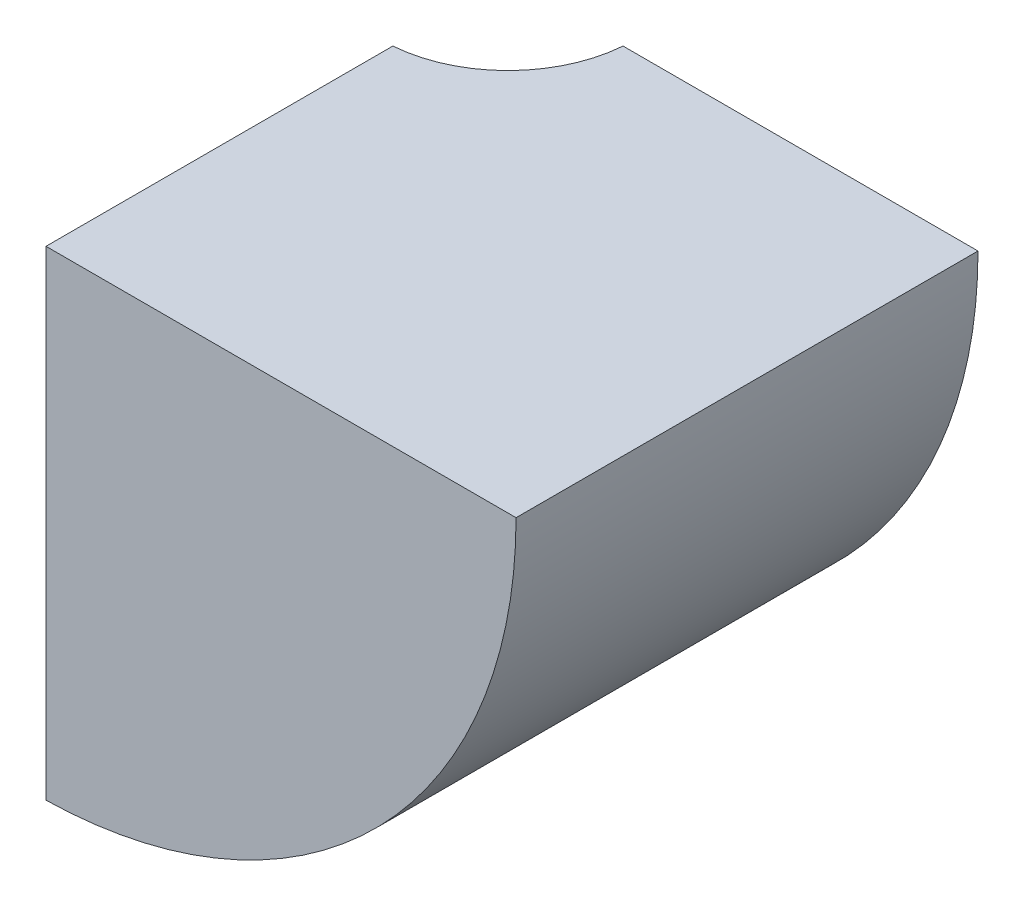
ISO-10303-21;
HEADER;
FILE_DESCRIPTION(('STEP AP214'),'2;1');
FILE_NAME('part.step','',(''),(''),'','','');
FILE_SCHEMA(('AUTOMOTIVE_DESIGN { 1 0 10303 214 1 1 1 1 }'));
ENDSEC;
DATA;
#1=APPLICATION_CONTEXT('core data for automotive mechanical design processes');
#2=APPLICATION_PROTOCOL_DEFINITION('international standard','automotive_design',2000,#1);
#3=PRODUCT_CONTEXT('',#1,'mechanical');
#4=PRODUCT('Part','Part','',(#3));
#5=PRODUCT_RELATED_PRODUCT_CATEGORY('part','',(#4));
#6=PRODUCT_DEFINITION_FORMATION('','',#4);
#7=PRODUCT_DEFINITION_CONTEXT('part definition',#1,'design');
#8=PRODUCT_DEFINITION('design','',#6,#7);
#9=PRODUCT_DEFINITION_SHAPE('','',#8);
#10=(LENGTH_UNIT() NAMED_UNIT(*) SI_UNIT(.MILLI.,.METRE.));
#11=(NAMED_UNIT(*) PLANE_ANGLE_UNIT() SI_UNIT($,.RADIAN.));
#12=(NAMED_UNIT(*) SI_UNIT($,.STERADIAN.) SOLID_ANGLE_UNIT());
#13=UNCERTAINTY_MEASURE_WITH_UNIT(LENGTH_MEASURE(1.E-05),#10,'distance_accuracy_value','');
#14=(GEOMETRIC_REPRESENTATION_CONTEXT(3) GLOBAL_UNCERTAINTY_ASSIGNED_CONTEXT((#13)) GLOBAL_UNIT_ASSIGNED_CONTEXT((#10,
#11,#12)) REPRESENTATION_CONTEXT('',''));
#15=CARTESIAN_POINT('',(0.,0.,0.));
#16=DIRECTION('',(0.,0.,1.));
#17=DIRECTION('',(1.,0.,0.));
#18=AXIS2_PLACEMENT_3D('',#15,#16,#17);
#19=CARTESIAN_POINT('',(0.,0.,29.));
#20=DIRECTION('',(0.,0.,-1.));
#21=DIRECTION('',(-1.,0.,0.));
#22=AXIS2_PLACEMENT_3D('',#19,#20,#21);
#23=CYLINDRICAL_SURFACE('',#22,29.5);
#24=CARTESIAN_POINT('',(0.,0.,29.));
#25=DIRECTION('',(0.,0.,1.));
#26=DIRECTION('',(1.,0.,0.));
#27=AXIS2_PLACEMENT_3D('',#24,#25,#26);
#28=CIRCLE('',#27,29.5);
#29=CARTESIAN_POINT('',(0.6,-29.4938976739257,29.));
#30=VERTEX_POINT('',#29);
#31=CARTESIAN_POINT('',(29.5,0.,29.));
#32=VERTEX_POINT('',#31);
#33=EDGE_CURVE('E100',#30,#32,#28,.T.);
#34=ORIENTED_EDGE('',*,*,#33,.F.);
#35=DIRECTION('',(0.,0.,-1.));
#36=VECTOR('',#35,1.);
#37=CARTESIAN_POINT('',(0.6,-29.4938976739257,29.));
#38=LINE('',#37,#36);
#39=CARTESIAN_POINT('',(0.6,-29.4938976739257,7.6765877836445));
#40=VERTEX_POINT('',#39);
#41=EDGE_CURVE('E81',#30,#40,#38,.T.);
#42=ORIENTED_EDGE('',*,*,#41,.T.);
#43=CARTESIAN_POINT('',(0.,-29.5,7.69999999999999));
#44=CARTESIAN_POINT('',(0.212742343388148,-29.500022647287,7.70002706474274));
#45=CARTESIAN_POINT('',(0.425476347259747,-29.4976994819734,7.69118445742644));
#46=CARTESIAN_POINT('',(0.849354949937432,-29.4885260735209,7.65595876865986));
#47=CARTESIAN_POINT('',(1.06049980460666,-29.4816765756339,7.62957857473477));
#48=CARTESIAN_POINT('',(1.47926599440452,-29.4636335809967,7.55954877837209));
#49=CARTESIAN_POINT('',(1.68689370037372,-29.4524490758022,7.51593491791784));
#50=CARTESIAN_POINT('',(2.09760532203794,-29.4260492673962,7.41180996030293));
#51=CARTESIAN_POINT('',(2.30068918116078,-29.4108339140298,7.35129865289055));
#52=CARTESIAN_POINT('',(2.70085358483705,-29.376788677435,7.21388483244407));
#53=CARTESIAN_POINT('',(2.89793579252656,-29.3579598063173,7.13698690847597));
#54=CARTESIAN_POINT('',(3.28491062238014,-29.3171832290267,6.96735321137268));
#55=CARTESIAN_POINT('',(3.47480055612946,-29.2952343709174,6.87461158599068));
#56=CARTESIAN_POINT('',(3.84609330616336,-29.2488047198207,6.67398660929673));
#57=CARTESIAN_POINT('',(4.02749559169331,-29.2243237688015,6.56610231275713));
#58=CARTESIAN_POINT('',(4.38066050734384,-29.17347508541,6.33594833876668));
#59=CARTESIAN_POINT('',(4.55242269336397,-29.1471072662405,6.21367799938121));
#60=CARTESIAN_POINT('',(4.88853747602184,-29.092641036983,5.95300965640012));
#61=CARTESIAN_POINT('',(5.05267535307612,-29.0645186660506,5.81433972678294));
#62=CARTESIAN_POINT('',(5.36875163654413,-29.0077971092044,5.52381971379875));
#63=CARTESIAN_POINT('',(5.52068990096989,-28.9791979177457,5.3719694770725));
#64=CARTESIAN_POINT('',(5.81141532781892,-28.9222993952559,5.05604045223973));
#65=CARTESIAN_POINT('',(5.95019933986526,-28.8940001374915,4.89195875148427));
#66=CARTESIAN_POINT('',(6.21364797125605,-28.8384934739615,4.55265974751919));
#67=CARTESIAN_POINT('',(6.33831294509316,-28.8112860407941,4.37744272406132));
#68=CARTESIAN_POINT('',(6.57464962851288,-28.7582840629336,4.01394635278045));
#69=CARTESIAN_POINT('',(6.6860660779084,-28.7325211760508,3.82549626700681));
#70=CARTESIAN_POINT('',(6.89253711732572,-28.6836919981863,3.43959390929711));
#71=CARTESIAN_POINT('',(6.98759781944607,-28.6606247009084,3.242145035227));
#72=CARTESIAN_POINT('',(7.16061533796719,-28.617888412141,2.8396363223017));
#73=CARTESIAN_POINT('',(7.2385805564665,-28.598217752285,2.63458028042393));
#74=CARTESIAN_POINT('',(7.37679403484349,-28.5628776323333,2.21833899961841));
#75=CARTESIAN_POINT('',(7.43704671442757,-28.5472071742194,2.00715530416308));
#76=CARTESIAN_POINT('',(7.55839066054057,-28.5153665186318,1.50047453454248));
#77=CARTESIAN_POINT('',(7.61144264862481,-28.501182313947,1.20285922851761));
#78=CARTESIAN_POINT('',(7.66454271555895,-28.4869279904295,0.753392453441745));
#79=CARTESIAN_POINT('',(7.67782974569565,-28.4833468881888,0.603080557191606));
#80=CARTESIAN_POINT('',(7.69555897327461,-28.4785607280752,0.301861036041828));
#81=CARTESIAN_POINT('',(7.69999897846711,-28.4773562591213,0.150953272769096));
#82=CARTESIAN_POINT('',(7.7,-28.4773594281492,0.));
#83=B_SPLINE_CURVE_WITH_KNOTS('',3,(#43,#44,#45,#46,#47,#48,#49,#50,#51,#52,#53,#54,#55,#56,#57,
#58,#59,#60,#61,#62,#63,#64,#65,#66,#67,#68,#69,#70,#71,#72,#73,#74,#75,#76,#77,#78,#79,#80,#81,
#82),.UNSPECIFIED.,.F.,.F.,(4,2,2,2,2,2,2,2,2,2,2,2,2,2,2,2,2,2,2,4),(0.,0.638017965139099,
1.27593090802698,1.91252772931685,2.54913247201258,3.18555916752925,3.82222145263155,
4.45892349681235,5.09565484857049,5.74502357539887,6.39439985895824,7.04393127394829,
7.69344637726192,8.35394086985032,9.01418799879507,9.67410989810249,10.3338669909095,
11.2392520050083,11.6918392132163,12.1445385563943),.UNSPECIFIED.);
#84=CARTESIAN_POINT('',(7.6765877836445,-28.4836795375878,0.600000000000001));
#85=VERTEX_POINT('',#84);
#86=EDGE_CURVE('E104',#40,#85,#83,.T.);
#87=ORIENTED_EDGE('',*,*,#86,.T.);
#88=CARTESIAN_POINT('',(0.,0.,0.600000000000003));
#89=DIRECTION('',(0.,0.,1.));
#90=DIRECTION('',(1.,0.,0.));
#91=AXIS2_PLACEMENT_3D('',#88,#89,#90);
#92=CIRCLE('',#91,29.5);
#93=CARTESIAN_POINT('',(29.5,0.,0.599999999999998));
#94=VERTEX_POINT('',#93);
#95=EDGE_CURVE('E62',#85,#94,#92,.T.);
#96=ORIENTED_EDGE('',*,*,#95,.T.);
#97=DIRECTION('',(0.,0.,1.));
#98=VECTOR('',#97,1.);
#99=CARTESIAN_POINT('',(29.5,0.,0.));
#100=LINE('',#99,#98);
#101=EDGE_CURVE('E103',#94,#32,#100,.T.);
#102=ORIENTED_EDGE('',*,*,#101,.T.);
#103=EDGE_LOOP('',(#34,#42,#87,#96,#102));
#104=FACE_BOUND('',#103,.T.);
#105=ADVANCED_FACE('F39',(#104),#23,.T.);
#106=CARTESIAN_POINT('',(0.,0.,29.));
#107=DIRECTION('',(0.,0.,1.));
#108=DIRECTION('',(1.,0.,0.));
#109=AXIS2_PLACEMENT_3D('',#106,#107,#108);
#110=PLANE('',#109);
#111=DIRECTION('',(0.,1.,0.));
#112=VECTOR('',#111,1.);
#113=CARTESIAN_POINT('',(0.6,-29.5,29.));
#114=LINE('',#113,#112);
#115=CARTESIAN_POINT('',(0.6,0.,29.));
#116=VERTEX_POINT('',#115);
#117=EDGE_CURVE('E78',#30,#116,#114,.T.);
#118=ORIENTED_EDGE('',*,*,#117,.F.);
#119=ORIENTED_EDGE('',*,*,#33,.T.);
#120=DIRECTION('',(1.,0.,0.));
#121=VECTOR('',#120,1.);
#122=CARTESIAN_POINT('',(0.,0.,29.));
#123=LINE('',#122,#121);
#124=EDGE_CURVE('E92',#116,#32,#123,.T.);
#125=ORIENTED_EDGE('',*,*,#124,.F.);
#126=EDGE_LOOP('',(#118,#119,#125));
#127=FACE_BOUND('',#126,.T.);
#128=ADVANCED_FACE('F99',(#127),#110,.T.);
#129=CARTESIAN_POINT('',(0.,0.,0.));
#130=DIRECTION('',(0.,-1.,0.));
#131=DIRECTION('',(0.,0.,-1.));
#132=AXIS2_PLACEMENT_3D('',#129,#130,#131);
#133=PLANE('',#132);
#134=CARTESIAN_POINT('',(0.,0.,0.));
#135=DIRECTION('',(0.,1.,0.));
#136=DIRECTION('',(0.,0.,1.));
#137=AXIS2_PLACEMENT_3D('',#134,#135,#136);
#138=CIRCLE('',#137,7.7);
#139=CARTESIAN_POINT('',(0.6,0.,7.6765877836445));
#140=VERTEX_POINT('',#139);
#141=CARTESIAN_POINT('',(7.6765877836445,0.,0.600000000000001));
#142=VERTEX_POINT('',#141);
#143=EDGE_CURVE('E95',#140,#142,#138,.T.);
#144=ORIENTED_EDGE('',*,*,#143,.F.);
#145=DIRECTION('',(0.,0.,-1.));
#146=VECTOR('',#145,1.);
#147=CARTESIAN_POINT('',(0.6,0.,29.));
#148=LINE('',#147,#146);
#149=EDGE_CURVE('E55',#116,#140,#148,.T.);
#150=ORIENTED_EDGE('',*,*,#149,.F.);
#151=ORIENTED_EDGE('',*,*,#124,.T.);
#152=ORIENTED_EDGE('',*,*,#101,.F.);
#153=DIRECTION('',(1.,0.,0.));
#154=VECTOR('',#153,1.);
#155=CARTESIAN_POINT('',(29.5,0.,0.599999999999998));
#156=LINE('',#155,#154);
#157=EDGE_CURVE('E97',#142,#94,#156,.T.);
#158=ORIENTED_EDGE('',*,*,#157,.F.);
#159=EDGE_LOOP('',(#144,#150,#151,#152,#158));
#160=FACE_BOUND('',#159,.T.);
#161=ADVANCED_FACE('F90',(#160),#133,.F.);
#162=CARTESIAN_POINT('',(0.,-29.5,0.));
#163=DIRECTION('',(0.,1.,0.));
#164=DIRECTION('',(0.,0.,1.));
#165=AXIS2_PLACEMENT_3D('',#162,#163,#164);
#166=CYLINDRICAL_SURFACE('',#165,7.7);
#167=ORIENTED_EDGE('',*,*,#86,.F.);
#168=DIRECTION('',(0.,1.,0.));
#169=VECTOR('',#168,1.);
#170=CARTESIAN_POINT('',(0.6,-29.5,7.6765877836445));
#171=LINE('',#170,#169);
#172=EDGE_CURVE('E11',#40,#140,#171,.T.);
#173=ORIENTED_EDGE('',*,*,#172,.T.);
#174=ORIENTED_EDGE('',*,*,#143,.T.);
#175=DIRECTION('',(0.,1.,0.));
#176=VECTOR('',#175,1.);
#177=CARTESIAN_POINT('',(7.6765877836445,-29.5,0.600000000000001));
#178=LINE('',#177,#176);
#179=EDGE_CURVE('E48',#142,#85,#178,.F.);
#180=ORIENTED_EDGE('',*,*,#179,.T.);
#181=EDGE_LOOP('',(#167,#173,#174,#180));
#182=FACE_BOUND('',#181,.T.);
#183=ADVANCED_FACE('F122',(#182),#166,.F.);
#184=CARTESIAN_POINT('',(29.5,-29.5,0.599999999999998));
#185=DIRECTION('',(0.,0.,1.));
#186=DIRECTION('',(1.,0.,0.));
#187=AXIS2_PLACEMENT_3D('',#184,#185,#186);
#188=PLANE('',#187);
#189=ORIENTED_EDGE('',*,*,#179,.F.);
#190=ORIENTED_EDGE('',*,*,#157,.T.);
#191=ORIENTED_EDGE('',*,*,#95,.F.);
#192=EDGE_LOOP('',(#189,#190,#191));
#193=FACE_BOUND('',#192,.T.);
#194=ADVANCED_FACE('F131',(#193),#188,.F.);
#195=CARTESIAN_POINT('',(0.6,-29.5,29.));
#196=DIRECTION('',(1.,0.,0.));
#197=DIRECTION('',(0.,0.,-1.));
#198=AXIS2_PLACEMENT_3D('',#195,#196,#197);
#199=PLANE('',#198);
#200=ORIENTED_EDGE('',*,*,#117,.T.);
#201=ORIENTED_EDGE('',*,*,#149,.T.);
#202=ORIENTED_EDGE('',*,*,#172,.F.);
#203=ORIENTED_EDGE('',*,*,#41,.F.);
#204=EDGE_LOOP('',(#200,#201,#202,#203));
#205=FACE_BOUND('',#204,.T.);
#206=ADVANCED_FACE('F79',(#205),#199,.F.);
#207=CLOSED_SHELL('',(#105,#128,#161,#183,#194,#206));
#208=MANIFOLD_SOLID_BREP('B2',#207);
#209=ADVANCED_BREP_SHAPE_REPRESENTATION('',(#18,#208),#14);
#210=SHAPE_DEFINITION_REPRESENTATION(#9,#209);
ENDSEC;
END-ISO-10303-21;
